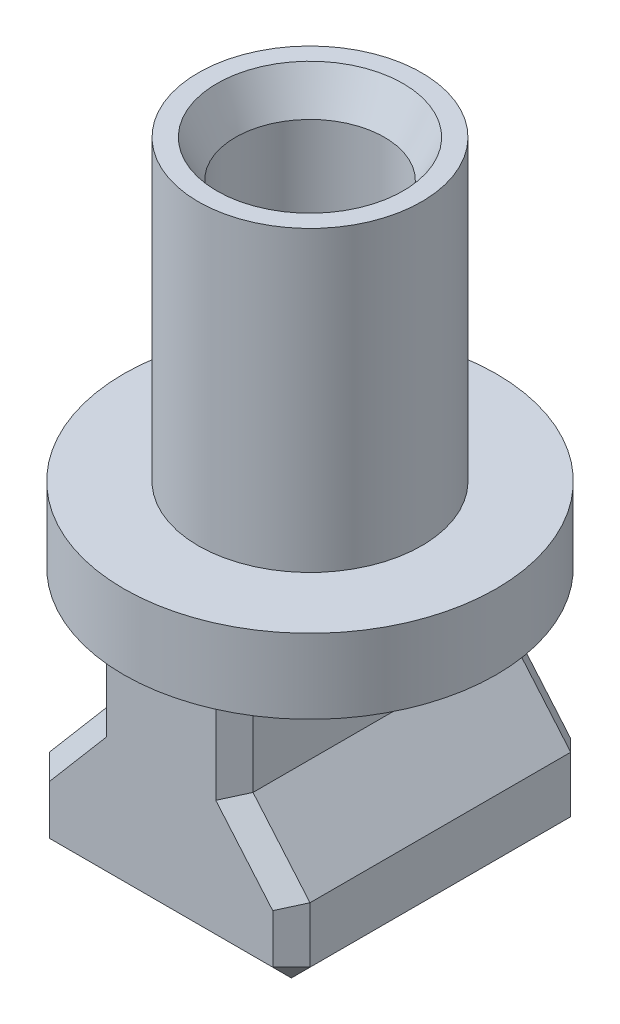
ISO-10303-21;
HEADER;
FILE_DESCRIPTION(('STEP AP214'),'2;1');
FILE_NAME('part.step','',(''),(''),'','','');
FILE_SCHEMA(('AUTOMOTIVE_DESIGN { 1 0 10303 214 1 1 1 1 }'));
ENDSEC;
DATA;
#1=APPLICATION_CONTEXT('core data for automotive mechanical design processes');
#2=APPLICATION_PROTOCOL_DEFINITION('international standard','automotive_design',2000,#1);
#3=PRODUCT_CONTEXT('',#1,'mechanical');
#4=PRODUCT('Part','Part','',(#3));
#5=PRODUCT_RELATED_PRODUCT_CATEGORY('part','',(#4));
#6=PRODUCT_DEFINITION_FORMATION('','',#4);
#7=PRODUCT_DEFINITION_CONTEXT('part definition',#1,'design');
#8=PRODUCT_DEFINITION('design','',#6,#7);
#9=PRODUCT_DEFINITION_SHAPE('','',#8);
#10=(LENGTH_UNIT() NAMED_UNIT(*) SI_UNIT(.MILLI.,.METRE.));
#11=(NAMED_UNIT(*) PLANE_ANGLE_UNIT() SI_UNIT($,.RADIAN.));
#12=(NAMED_UNIT(*) SI_UNIT($,.STERADIAN.) SOLID_ANGLE_UNIT());
#13=UNCERTAINTY_MEASURE_WITH_UNIT(LENGTH_MEASURE(1.E-05),#10,'distance_accuracy_value','');
#14=(GEOMETRIC_REPRESENTATION_CONTEXT(3) GLOBAL_UNCERTAINTY_ASSIGNED_CONTEXT((#13)) GLOBAL_UNIT_ASSIGNED_CONTEXT((#10,
#11,#12)) REPRESENTATION_CONTEXT('',''));
#15=CARTESIAN_POINT('',(0.,0.,0.));
#16=DIRECTION('',(0.,0.,1.));
#17=DIRECTION('',(1.,0.,0.));
#18=AXIS2_PLACEMENT_3D('',#15,#16,#17);
#19=CARTESIAN_POINT('',(-0.142171186372,-8.3,0.));
#20=DIRECTION('',(1.,0.,0.));
#21=DIRECTION('',(0.,0.,-1.));
#22=AXIS2_PLACEMENT_3D('',#19,#20,#21);
#23=PLANE('',#22);
#24=DIRECTION('',(0.,0.,-1.));
#25=VECTOR('',#24,1.);
#26=CARTESIAN_POINT('',(-0.142171186372,-2.,0.));
#27=LINE('',#26,#25);
#28=CARTESIAN_POINT('',(-0.142171186372,-2.,25.1199688894745));
#29=VERTEX_POINT('',#28);
#30=CARTESIAN_POINT('',(-0.142171186372,-2.,18.1199688894745));
#31=VERTEX_POINT('',#30);
#32=EDGE_CURVE('E274',#29,#31,#27,.T.);
#33=ORIENTED_EDGE('',*,*,#32,.T.);
#34=DIRECTION('',(0.,-1.,0.));
#35=VECTOR('',#34,1.);
#36=CARTESIAN_POINT('',(-0.142171186372,-8.3,18.1199688894745));
#37=LINE('',#36,#35);
#38=CARTESIAN_POINT('',(-0.142171186372,-4.5,18.1199688894745));
#39=VERTEX_POINT('',#38);
#40=EDGE_CURVE('E310',#31,#39,#37,.T.);
#41=ORIENTED_EDGE('',*,*,#40,.T.);
#42=DIRECTION('',(0.,0.,1.));
#43=VECTOR('',#42,1.);
#44=CARTESIAN_POINT('',(-0.142171186372,-4.5,13.5235192071276));
#45=LINE('',#44,#43);
#46=CARTESIAN_POINT('',(-0.142171186372,-4.5,25.1199688894745));
#47=VERTEX_POINT('',#46);
#48=EDGE_CURVE('E242',#39,#47,#45,.T.);
#49=ORIENTED_EDGE('',*,*,#48,.T.);
#50=DIRECTION('',(0.,1.,0.));
#51=VECTOR('',#50,1.);
#52=CARTESIAN_POINT('',(-0.142171186372,-2.,25.1199688894745));
#53=LINE('',#52,#51);
#54=EDGE_CURVE('E308',#47,#29,#53,.T.);
#55=ORIENTED_EDGE('',*,*,#54,.T.);
#56=EDGE_LOOP('',(#33,#41,#49,#55));
#57=FACE_BOUND('',#56,.T.);
#58=ADVANCED_FACE('F48',(#57),#23,.F.);
#59=CARTESIAN_POINT('',(0.,-2.,25.6199688894745));
#60=DIRECTION('',(0.,0.,1.));
#61=DIRECTION('',(1.,0.,0.));
#62=AXIS2_PLACEMENT_3D('',#59,#60,#61);
#63=PLANE('',#62);
#64=DIRECTION('',(-0.64764842009554,0.761939317759459,0.));
#65=VECTOR('',#64,1.);
#66=CARTESIAN_POINT('',(0.590193658175706,-1.49833539055065,25.6199688894745));
#67=LINE('',#66,#65);
#68=CARTESIAN_POINT('',(4.82782881362799,-6.48378851461216,25.6199688894745));
#69=VERTEX_POINT('',#68);
#70=CARTESIAN_POINT('',(3.29782881362799,-4.68378851461216,25.6199688894745));
#71=VERTEX_POINT('',#70);
#72=EDGE_CURVE('E66',#69,#71,#67,.T.);
#73=ORIENTED_EDGE('',*,*,#72,.T.);
#74=DIRECTION('',(0.,1.,0.));
#75=VECTOR('',#74,1.);
#76=CARTESIAN_POINT('',(3.29782881362799,-2.,25.6199688894745));
#77=LINE('',#76,#75);
#78=CARTESIAN_POINT('',(3.29782881362799,-2.,25.6199688894745));
#79=VERTEX_POINT('',#78);
#80=EDGE_CURVE('E345',#71,#79,#77,.T.);
#81=ORIENTED_EDGE('',*,*,#80,.T.);
#82=DIRECTION('',(1.,0.,0.));
#83=VECTOR('',#82,1.);
#84=CARTESIAN_POINT('',(0.,-2.,25.6199688894745));
#85=LINE('',#84,#83);
#86=CARTESIAN_POINT('',(0.357828813628009,-2.,25.6199688894745));
#87=VERTEX_POINT('',#86);
#88=EDGE_CURVE('E279',#87,#79,#85,.T.);
#89=ORIENTED_EDGE('',*,*,#88,.F.);
#90=DIRECTION('',(0.,-1.,0.));
#91=VECTOR('',#90,1.);
#92=CARTESIAN_POINT('',(0.357828813628009,-4.5,25.6199688894745));
#93=LINE('',#92,#91);
#94=CARTESIAN_POINT('',(0.357828813628009,-4.68378851461216,25.6199688894745));
#95=VERTEX_POINT('',#94);
#96=EDGE_CURVE('E335',#87,#95,#93,.T.);
#97=ORIENTED_EDGE('',*,*,#96,.T.);
#98=DIRECTION('',(-0.647648420095541,-0.761939317759459,0.));
#99=VECTOR('',#98,1.);
#100=CARTESIAN_POINT('',(-1.29120152749226,-6.62382421004778,25.6199688894745));
#101=LINE('',#100,#99);
#102=CARTESIAN_POINT('',(-1.17217118637199,-6.48378851461216,25.6199688894745));
#103=VERTEX_POINT('',#102);
#104=EDGE_CURVE('E337',#95,#103,#101,.T.);
#105=ORIENTED_EDGE('',*,*,#104,.T.);
#106=DIRECTION('',(0.,-1.,0.));
#107=VECTOR('',#106,1.);
#108=CARTESIAN_POINT('',(-1.17217118637199,-2.,25.6199688894745));
#109=LINE('',#108,#107);
#110=CARTESIAN_POINT('',(-1.17217118637199,-7.79999999999999,25.6199688894745));
#111=VERTEX_POINT('',#110);
#112=EDGE_CURVE('E339',#103,#111,#109,.T.);
#113=ORIENTED_EDGE('',*,*,#112,.T.);
#114=DIRECTION('',(1.,0.,0.));
#115=VECTOR('',#114,1.);
#116=CARTESIAN_POINT('',(0.,-7.79999999999999,25.6199688894745));
#117=LINE('',#116,#115);
#118=CARTESIAN_POINT('',(4.82782881362799,-7.79999999999999,25.6199688894745));
#119=VERTEX_POINT('',#118);
#120=EDGE_CURVE('E341',#111,#119,#117,.T.);
#121=ORIENTED_EDGE('',*,*,#120,.T.);
#122=DIRECTION('',(0.,1.,0.));
#123=VECTOR('',#122,1.);
#124=CARTESIAN_POINT('',(4.82782881362799,-6.3,25.6199688894745));
#125=LINE('',#124,#123);
#126=EDGE_CURVE('E71',#119,#69,#125,.T.);
#127=ORIENTED_EDGE('',*,*,#126,.T.);
#128=EDGE_LOOP('',(#73,#81,#89,#97,#105,#113,#121,#127));
#129=FACE_BOUND('',#128,.T.);
#130=ADVANCED_FACE('F438',(#129),#63,.T.);
#131=CARTESIAN_POINT('',(0.,-8.3,0.));
#132=DIRECTION('',(0.,-1.,0.));
#133=DIRECTION('',(0.,0.,-1.));
#134=AXIS2_PLACEMENT_3D('',#131,#132,#133);
#135=PLANE('',#134);
#136=DIRECTION('',(0.,0.,-1.));
#137=VECTOR('',#136,1.);
#138=CARTESIAN_POINT('',(-1.17217118637199,-8.3,0.));
#139=LINE('',#138,#137);
#140=CARTESIAN_POINT('',(-1.17217118637199,-8.3,25.1199688894745));
#141=VERTEX_POINT('',#140);
#142=CARTESIAN_POINT('',(-1.17217118637199,-8.3,18.1199688894745));
#143=VERTEX_POINT('',#142);
#144=EDGE_CURVE('E183',#141,#143,#139,.T.);
#145=ORIENTED_EDGE('',*,*,#144,.T.);
#146=DIRECTION('',(1.,0.,0.));
#147=VECTOR('',#146,1.);
#148=CARTESIAN_POINT('',(5.327828813628,-8.3,18.1199688894745));
#149=LINE('',#148,#147);
#150=CARTESIAN_POINT('',(4.827828813628,-8.3,18.1199688894745));
#151=VERTEX_POINT('',#150);
#152=EDGE_CURVE('E179',#143,#151,#149,.T.);
#153=ORIENTED_EDGE('',*,*,#152,.T.);
#154=DIRECTION('',(0.,0.,1.));
#155=VECTOR('',#154,1.);
#156=CARTESIAN_POINT('',(4.827828813628,-8.3,25.6199688894745));
#157=LINE('',#156,#155);
#158=CARTESIAN_POINT('',(4.827828813628,-8.3,25.1199688894745));
#159=VERTEX_POINT('',#158);
#160=EDGE_CURVE('E173',#151,#159,#157,.T.);
#161=ORIENTED_EDGE('',*,*,#160,.T.);
#162=DIRECTION('',(-1.,0.,0.));
#163=VECTOR('',#162,1.);
#164=CARTESIAN_POINT('',(0.,-8.3,25.1199688894745));
#165=LINE('',#164,#163);
#166=EDGE_CURVE('E176',#159,#141,#165,.T.);
#167=ORIENTED_EDGE('',*,*,#166,.T.);
#168=EDGE_LOOP('',(#145,#153,#161,#167));
#169=FACE_BOUND('',#168,.T.);
#170=ADVANCED_FACE('F175',(#169),#135,.T.);
#171=CARTESIAN_POINT('',(3.797828813628,-8.3,0.));
#172=DIRECTION('',(1.,0.,0.));
#173=DIRECTION('',(0.,0.,-1.));
#174=AXIS2_PLACEMENT_3D('',#171,#172,#173);
#175=PLANE('',#174);
#176=DIRECTION('',(0.,0.,1.));
#177=VECTOR('',#176,1.);
#178=CARTESIAN_POINT('',(3.797828813628,-4.5,13.5235192071276));
#179=LINE('',#178,#177);
#180=CARTESIAN_POINT('',(3.797828813628,-4.5,18.1199688894745));
#181=VERTEX_POINT('',#180);
#182=CARTESIAN_POINT('',(3.797828813628,-4.5,25.1199688894745));
#183=VERTEX_POINT('',#182);
#184=EDGE_CURVE('E262',#181,#183,#179,.T.);
#185=ORIENTED_EDGE('',*,*,#184,.F.);
#186=DIRECTION('',(0.,1.,0.));
#187=VECTOR('',#186,1.);
#188=CARTESIAN_POINT('',(3.797828813628,-2.,18.1199688894745));
#189=LINE('',#188,#187);
#190=CARTESIAN_POINT('',(3.797828813628,-2.,18.1199688894745));
#191=VERTEX_POINT('',#190);
#192=EDGE_CURVE('E324',#181,#191,#189,.T.);
#193=ORIENTED_EDGE('',*,*,#192,.T.);
#194=DIRECTION('',(0.,0.,-1.));
#195=VECTOR('',#194,1.);
#196=CARTESIAN_POINT('',(3.797828813628,-2.,0.));
#197=LINE('',#196,#195);
#198=CARTESIAN_POINT('',(3.797828813628,-2.,25.1199688894745));
#199=VERTEX_POINT('',#198);
#200=EDGE_CURVE('E270',#199,#191,#197,.T.);
#201=ORIENTED_EDGE('',*,*,#200,.F.);
#202=DIRECTION('',(0.,-1.,0.));
#203=VECTOR('',#202,1.);
#204=CARTESIAN_POINT('',(3.797828813628,-8.3,25.1199688894745));
#205=LINE('',#204,#203);
#206=EDGE_CURVE('E322',#199,#183,#205,.T.);
#207=ORIENTED_EDGE('',*,*,#206,.T.);
#208=EDGE_LOOP('',(#185,#193,#201,#207));
#209=FACE_BOUND('',#208,.T.);
#210=ADVANCED_FACE('F411',(#209),#175,.T.);
#211=CARTESIAN_POINT('',(0.,-8.3,17.6199688894745));
#212=DIRECTION('',(0.,0.,1.));
#213=DIRECTION('',(1.,0.,0.));
#214=AXIS2_PLACEMENT_3D('',#211,#212,#213);
#215=PLANE('',#214);
#216=DIRECTION('',(0.647648420095541,0.761939317759459,0.));
#217=VECTOR('',#216,1.);
#218=CARTESIAN_POINT('',(-1.57674946238122,-6.95976295697596,17.6199688894745));
#219=LINE('',#218,#217);
#220=CARTESIAN_POINT('',(-1.172171186372,-6.48378851461217,17.6199688894745));
#221=VERTEX_POINT('',#220);
#222=CARTESIAN_POINT('',(0.357828813628009,-4.68378851461216,17.6199688894745));
#223=VERTEX_POINT('',#222);
#224=EDGE_CURVE('E304',#221,#223,#219,.T.);
#225=ORIENTED_EDGE('',*,*,#224,.T.);
#226=DIRECTION('',(0.,1.,0.));
#227=VECTOR('',#226,1.);
#228=CARTESIAN_POINT('',(0.357828813628009,-8.3,17.6199688894745));
#229=LINE('',#228,#227);
#230=CARTESIAN_POINT('',(0.357828813628009,-2.,17.6199688894745));
#231=VERTEX_POINT('',#230);
#232=EDGE_CURVE('E306',#223,#231,#229,.T.);
#233=ORIENTED_EDGE('',*,*,#232,.T.);
#234=DIRECTION('',(1.,0.,0.));
#235=VECTOR('',#234,1.);
#236=CARTESIAN_POINT('',(0.,-2.,17.6199688894745));
#237=LINE('',#236,#235);
#238=CARTESIAN_POINT('',(3.29782881362799,-2.,17.6199688894745));
#239=VERTEX_POINT('',#238);
#240=EDGE_CURVE('E282',#231,#239,#237,.T.);
#241=ORIENTED_EDGE('',*,*,#240,.T.);
#242=DIRECTION('',(0.,-1.,0.));
#243=VECTOR('',#242,1.);
#244=CARTESIAN_POINT('',(3.29782881362799,-4.5,17.6199688894745));
#245=LINE('',#244,#243);
#246=CARTESIAN_POINT('',(3.29782881362799,-4.68378851461215,17.6199688894745));
#247=VERTEX_POINT('',#246);
#248=EDGE_CURVE('E297',#239,#247,#245,.T.);
#249=ORIENTED_EDGE('',*,*,#248,.T.);
#250=DIRECTION('',(0.64764842009554,-0.761939317759459,0.));
#251=VECTOR('',#250,1.);
#252=CARTESIAN_POINT('',(4.94685915474827,-6.62382421004777,17.6199688894745));
#253=LINE('',#252,#251);
#254=CARTESIAN_POINT('',(4.82782881362799,-6.48378851461215,17.6199688894745));
#255=VERTEX_POINT('',#254);
#256=EDGE_CURVE('E295',#247,#255,#253,.T.);
#257=ORIENTED_EDGE('',*,*,#256,.T.);
#258=DIRECTION('',(0.,-1.,0.));
#259=VECTOR('',#258,1.);
#260=CARTESIAN_POINT('',(4.82782881362799,-8.3,17.6199688894745));
#261=LINE('',#260,#259);
#262=CARTESIAN_POINT('',(4.82782881362799,-7.79999999999999,17.6199688894745));
#263=VERTEX_POINT('',#262);
#264=EDGE_CURVE('E293',#255,#263,#261,.T.);
#265=ORIENTED_EDGE('',*,*,#264,.T.);
#266=DIRECTION('',(-1.,0.,0.));
#267=VECTOR('',#266,1.);
#268=CARTESIAN_POINT('',(-1.672171186372,-7.79999999999999,17.6199688894745));
#269=LINE('',#268,#267);
#270=CARTESIAN_POINT('',(-1.172171186372,-7.79999999999999,17.6199688894745));
#271=VERTEX_POINT('',#270);
#272=EDGE_CURVE('E299',#263,#271,#269,.T.);
#273=ORIENTED_EDGE('',*,*,#272,.T.);
#274=DIRECTION('',(0.,1.,0.));
#275=VECTOR('',#274,1.);
#276=CARTESIAN_POINT('',(-1.172171186372,-6.3,17.6199688894745));
#277=LINE('',#276,#275);
#278=EDGE_CURVE('E302',#271,#221,#277,.T.);
#279=ORIENTED_EDGE('',*,*,#278,.T.);
#280=EDGE_LOOP('',(#225,#233,#241,#249,#257,#265,#273,#279));
#281=FACE_BOUND('',#280,.T.);
#282=ADVANCED_FACE('F378',(#281),#215,.F.);
#283=CARTESIAN_POINT('',(1.827828813628,-2.,21.6199688894745));
#284=DIRECTION('',(0.,1.,0.));
#285=DIRECTION('',(0.,0.,1.));
#286=AXIS2_PLACEMENT_3D('',#283,#284,#285);
#287=PLANE('',#286);
#288=CARTESIAN_POINT('',(1.827828813628,-2.,21.6199688894745));
#289=DIRECTION('',(0.,1.,0.));
#290=DIRECTION('',(0.,0.,1.));
#291=AXIS2_PLACEMENT_3D('',#288,#289,#290);
#292=CIRCLE('',#291,5.);
#293=CARTESIAN_POINT('',(1.827828813628,-2.,26.6199688894745));
#294=VERTEX_POINT('',#293);
#295=EDGE_CURVE('E265',#294,#294,#292,.T.);
#296=ORIENTED_EDGE('',*,*,#295,.F.);
#297=EDGE_LOOP('',(#296));
#298=FACE_BOUND('',#297,.T.);
#299=ORIENTED_EDGE('',*,*,#32,.F.);
#300=DIRECTION('',(0.707106781186551,0.,0.707106781186544));
#301=VECTOR('',#300,1.);
#302=CARTESIAN_POINT('',(-0.907171186371988,-2.,24.3549688894745));
#303=LINE('',#302,#301);
#304=EDGE_CURVE('E13',#29,#87,#303,.T.);
#305=ORIENTED_EDGE('',*,*,#304,.T.);
#306=ORIENTED_EDGE('',*,*,#88,.T.);
#307=DIRECTION('',(-0.707106781186551,0.,0.707106781186544));
#308=VECTOR('',#307,1.);
#309=CARTESIAN_POINT('',(4.56282881362799,-2.,24.3549688894745));
#310=LINE('',#309,#308);
#311=EDGE_CURVE('E58',#79,#199,#310,.F.);
#312=ORIENTED_EDGE('',*,*,#311,.T.);
#313=ORIENTED_EDGE('',*,*,#200,.T.);
#314=DIRECTION('',(-0.707106781186551,0.,-0.707106781186544));
#315=VECTOR('',#314,1.);
#316=CARTESIAN_POINT('',(4.56282881362799,-2.,18.8849688894745));
#317=LINE('',#316,#315);
#318=EDGE_CURVE('E349',#191,#239,#317,.T.);
#319=ORIENTED_EDGE('',*,*,#318,.T.);
#320=ORIENTED_EDGE('',*,*,#240,.F.);
#321=DIRECTION('',(0.707106781186551,0.,-0.707106781186544));
#322=VECTOR('',#321,1.);
#323=CARTESIAN_POINT('',(-0.907171186371988,-2.,18.8849688894745));
#324=LINE('',#323,#322);
#325=EDGE_CURVE('E347',#231,#31,#324,.F.);
#326=ORIENTED_EDGE('',*,*,#325,.T.);
#327=EDGE_LOOP('',(#299,#305,#306,#312,#313,#319,#320,#326));
#328=FACE_BOUND('',#327,.T.);
#329=ADVANCED_FACE('F415',(#298,#328),#287,.F.);
#330=CARTESIAN_POINT('',(1.827828813628,0.,21.6199688894745));
#331=DIRECTION('',(0.,-1.,0.));
#332=DIRECTION('',(0.,0.,-1.));
#333=AXIS2_PLACEMENT_3D('',#330,#331,#332);
#334=CYLINDRICAL_SURFACE('',#333,5.);
#335=CARTESIAN_POINT('',(1.827828813628,0.,21.6199688894745));
#336=DIRECTION('',(0.,1.,0.));
#337=DIRECTION('',(0.,0.,1.));
#338=AXIS2_PLACEMENT_3D('',#335,#336,#337);
#339=CIRCLE('',#338,5.);
#340=CARTESIAN_POINT('',(1.827828813628,0.,26.6199688894745));
#341=VERTEX_POINT('',#340);
#342=EDGE_CURVE('E271',#341,#341,#339,.T.);
#343=ORIENTED_EDGE('',*,*,#342,.F.);
#344=EDGE_LOOP('',(#343));
#345=FACE_BOUND('',#344,.T.);
#346=ORIENTED_EDGE('',*,*,#295,.T.);
#347=EDGE_LOOP('',(#346));
#348=FACE_BOUND('',#347,.T.);
#349=ADVANCED_FACE('F452',(#345,#348),#334,.T.);
#350=CARTESIAN_POINT('',(1.827828813628,0.,21.6199688894745));
#351=DIRECTION('',(0.,1.,0.));
#352=DIRECTION('',(0.,0.,1.));
#353=AXIS2_PLACEMENT_3D('',#350,#351,#352);
#354=PLANE('',#353);
#355=CARTESIAN_POINT('',(1.827828813628,0.,21.6199688894745));
#356=DIRECTION('',(0.,1.,0.));
#357=DIRECTION('',(0.,0.,1.));
#358=AXIS2_PLACEMENT_3D('',#355,#356,#357);
#359=CIRCLE('',#358,3.);
#360=CARTESIAN_POINT('',(1.827828813628,0.,24.6199688894745));
#361=VERTEX_POINT('',#360);
#362=EDGE_CURVE('E266',#361,#361,#359,.T.);
#363=ORIENTED_EDGE('',*,*,#362,.F.);
#364=EDGE_LOOP('',(#363));
#365=FACE_BOUND('',#364,.T.);
#366=ORIENTED_EDGE('',*,*,#342,.T.);
#367=EDGE_LOOP('',(#366));
#368=FACE_BOUND('',#367,.T.);
#369=ADVANCED_FACE('F459',(#365,#368),#354,.T.);
#370=CARTESIAN_POINT('',(1.827828813628,8.,21.6199688894745));
#371=DIRECTION('',(0.,-1.,0.));
#372=DIRECTION('',(0.,0.,-1.));
#373=AXIS2_PLACEMENT_3D('',#370,#371,#372);
#374=CYLINDRICAL_SURFACE('',#373,3.);
#375=CARTESIAN_POINT('',(1.827828813628,8.,21.6199688894745));
#376=DIRECTION('',(0.,1.,0.));
#377=DIRECTION('',(0.,0.,1.));
#378=AXIS2_PLACEMENT_3D('',#375,#376,#377);
#379=CIRCLE('',#378,3.);
#380=CARTESIAN_POINT('',(1.827828813628,8.,24.6199688894745));
#381=VERTEX_POINT('',#380);
#382=EDGE_CURVE('E261',#381,#381,#379,.T.);
#383=ORIENTED_EDGE('',*,*,#382,.F.);
#384=EDGE_LOOP('',(#383));
#385=FACE_BOUND('',#384,.T.);
#386=ORIENTED_EDGE('',*,*,#362,.T.);
#387=EDGE_LOOP('',(#386));
#388=FACE_BOUND('',#387,.T.);
#389=ADVANCED_FACE('F464',(#385,#388),#374,.T.);
#390=CARTESIAN_POINT('',(1.827828813628,8.,21.6199688894745));
#391=DIRECTION('',(0.,1.,0.));
#392=DIRECTION('',(0.,0.,1.));
#393=AXIS2_PLACEMENT_3D('',#390,#391,#392);
#394=PLANE('',#393);
#395=CARTESIAN_POINT('',(1.827828813628,8.,21.6199688894745));
#396=DIRECTION('',(0.,1.,0.));
#397=DIRECTION('',(0.,0.,1.));
#398=AXIS2_PLACEMENT_3D('',#395,#396,#397);
#399=CIRCLE('',#398,2.50000000000001);
#400=CARTESIAN_POINT('',(1.827828813628,8.,24.1199688894745));
#401=VERTEX_POINT('',#400);
#402=EDGE_CURVE('E195',#401,#401,#399,.F.);
#403=ORIENTED_EDGE('',*,*,#402,.T.);
#404=EDGE_LOOP('',(#403));
#405=FACE_BOUND('',#404,.T.);
#406=ORIENTED_EDGE('',*,*,#382,.T.);
#407=EDGE_LOOP('',(#406));
#408=FACE_BOUND('',#407,.T.);
#409=ADVANCED_FACE('F468',(#405,#408),#394,.T.);
#410=CARTESIAN_POINT('',(1.827828813628,-5.65685424949238,21.6199688894745));
#411=DIRECTION('',(0.,1.,0.));
#412=DIRECTION('',(0.,0.,1.));
#413=AXIS2_PLACEMENT_3D('',#410,#411,#412);
#414=CYLINDRICAL_SURFACE('',#413,2.);
#415=CARTESIAN_POINT('',(1.827828813628,6.99999999999999,21.6199688894745));
#416=DIRECTION('',(0.,1.,0.));
#417=DIRECTION('',(0.,0.,1.));
#418=AXIS2_PLACEMENT_3D('',#415,#416,#417);
#419=CIRCLE('',#418,2.);
#420=CARTESIAN_POINT('',(1.827828813628,6.99999999999999,23.6199688894745));
#421=VERTEX_POINT('',#420);
#422=EDGE_CURVE('E269',#421,#421,#419,.T.);
#423=ORIENTED_EDGE('',*,*,#422,.T.);
#424=EDGE_LOOP('',(#423));
#425=FACE_BOUND('',#424,.T.);
#426=CARTESIAN_POINT('',(1.827828813628,0.,21.6199688894745));
#427=DIRECTION('',(0.,1.,0.));
#428=DIRECTION('',(0.,0.,1.));
#429=AXIS2_PLACEMENT_3D('',#426,#427,#428);
#430=CIRCLE('',#429,2.);
#431=CARTESIAN_POINT('',(1.827828813628,0.,23.6199688894745));
#432=VERTEX_POINT('',#431);
#433=EDGE_CURVE('E258',#432,#432,#430,.F.);
#434=ORIENTED_EDGE('',*,*,#433,.T.);
#435=EDGE_LOOP('',(#434));
#436=FACE_BOUND('',#435,.T.);
#437=ADVANCED_FACE('F472',(#425,#436),#414,.F.);
#438=CARTESIAN_POINT('',(1.827828813628,0.,21.6199688894745));
#439=DIRECTION('',(0.,1.,0.));
#440=DIRECTION('',(0.,0.,1.));
#441=AXIS2_PLACEMENT_3D('',#438,#439,#440);
#442=PLANE('',#441);
#443=ORIENTED_EDGE('',*,*,#433,.F.);
#444=EDGE_LOOP('',(#443));
#445=FACE_BOUND('',#444,.T.);
#446=ADVANCED_FACE('F476',(#445),#442,.T.);
#447=CARTESIAN_POINT('',(1.827828813628,6.99999999999999,21.6199688894745));
#448=DIRECTION('',(0.,1.,0.));
#449=DIRECTION('',(0.,0.,1.));
#450=AXIS2_PLACEMENT_3D('',#447,#448,#449);
#451=CONICAL_SURFACE('',#450,2.,0.463647609000806);
#452=ORIENTED_EDGE('',*,*,#402,.F.);
#453=EDGE_LOOP('',(#452));
#454=FACE_BOUND('',#453,.T.);
#455=ORIENTED_EDGE('',*,*,#422,.F.);
#456=EDGE_LOOP('',(#455));
#457=FACE_BOUND('',#456,.T.);
#458=ADVANCED_FACE('F480',(#454,#457),#451,.F.);
#459=CARTESIAN_POINT('',(-1.672171186372,0.,13.5235192071276));
#460=DIRECTION('',(-1.,0.,0.));
#461=DIRECTION('',(0.,-1.,0.));
#462=AXIS2_PLACEMENT_3D('',#459,#460,#461);
#463=PLANE('',#462);
#464=DIRECTION('',(0.,0.,1.));
#465=VECTOR('',#464,1.);
#466=CARTESIAN_POINT('',(-1.672171186372,-6.3,13.5235192071276));
#467=LINE('',#466,#465);
#468=CARTESIAN_POINT('',(-1.672171186372,-6.3,18.1199688894745));
#469=VERTEX_POINT('',#468);
#470=CARTESIAN_POINT('',(-1.672171186372,-6.3,25.1199688894745));
#471=VERTEX_POINT('',#470);
#472=EDGE_CURVE('E248',#469,#471,#467,.T.);
#473=ORIENTED_EDGE('',*,*,#472,.F.);
#474=DIRECTION('',(0.,-1.,0.));
#475=VECTOR('',#474,1.);
#476=CARTESIAN_POINT('',(-1.672171186372,-8.3,18.1199688894745));
#477=LINE('',#476,#475);
#478=CARTESIAN_POINT('',(-1.672171186372,-7.8,18.1199688894745));
#479=VERTEX_POINT('',#478);
#480=EDGE_CURVE('E320',#469,#479,#477,.T.);
#481=ORIENTED_EDGE('',*,*,#480,.T.);
#482=DIRECTION('',(0.,0.,1.));
#483=VECTOR('',#482,1.);
#484=CARTESIAN_POINT('',(-1.672171186372,-7.8,13.5235192071276));
#485=LINE('',#484,#483);
#486=CARTESIAN_POINT('',(-1.672171186372,-7.8,25.1199688894745));
#487=VERTEX_POINT('',#486);
#488=EDGE_CURVE('E318',#479,#487,#485,.T.);
#489=ORIENTED_EDGE('',*,*,#488,.T.);
#490=DIRECTION('',(0.,1.,0.));
#491=VECTOR('',#490,1.);
#492=CARTESIAN_POINT('',(-1.672171186372,0.,25.1199688894745));
#493=LINE('',#492,#491);
#494=EDGE_CURVE('E316',#487,#471,#493,.T.);
#495=ORIENTED_EDGE('',*,*,#494,.T.);
#496=EDGE_LOOP('',(#473,#481,#489,#495));
#497=FACE_BOUND('',#496,.T.);
#498=ADVANCED_FACE('F482',(#497),#463,.T.);
#499=CARTESIAN_POINT('',(2.13807188019042,-1.81736109816186,13.5235192071276));
#500=DIRECTION('',(0.761939317759459,-0.647648420095541,0.));
#501=DIRECTION('',(0.647648420095541,0.761939317759459,0.));
#502=AXIS2_PLACEMENT_3D('',#499,#500,#501);
#503=PLANE('',#502);
#504=ORIENTED_EDGE('',*,*,#48,.F.);
#505=DIRECTION('',(-0.647648420095541,-0.761939317759459,0.));
#506=VECTOR('',#505,1.);
#507=CARTESIAN_POINT('',(2.13807188019042,-1.81736109816186,18.1199688894745));
#508=LINE('',#507,#506);
#509=EDGE_CURVE('E314',#39,#469,#508,.T.);
#510=ORIENTED_EDGE('',*,*,#509,.T.);
#511=ORIENTED_EDGE('',*,*,#472,.T.);
#512=DIRECTION('',(0.647648420095541,0.761939317759459,0.));
#513=VECTOR('',#512,1.);
#514=CARTESIAN_POINT('',(-0.142171186372,-4.5,25.1199688894745));
#515=LINE('',#514,#513);
#516=EDGE_CURVE('E312',#471,#47,#515,.T.);
#517=ORIENTED_EDGE('',*,*,#516,.T.);
#518=EDGE_LOOP('',(#504,#510,#511,#517));
#519=FACE_BOUND('',#518,.T.);
#520=ADVANCED_FACE('F485',(#519),#503,.F.);
#521=CARTESIAN_POINT('',(-0.0157742736557328,-0.0134081326073729,13.5235192071276));
#522=DIRECTION('',(0.761939317759459,0.64764842009554,0.));
#523=DIRECTION('',(-0.64764842009554,0.761939317759459,0.));
#524=AXIS2_PLACEMENT_3D('',#521,#522,#523);
#525=PLANE('',#524);
#526=DIRECTION('',(0.,0.,1.));
#527=VECTOR('',#526,1.);
#528=CARTESIAN_POINT('',(5.327828813628,-6.3,13.5235192071276));
#529=LINE('',#528,#527);
#530=CARTESIAN_POINT('',(5.327828813628,-6.3,18.1199688894745));
#531=VERTEX_POINT('',#530);
#532=CARTESIAN_POINT('',(5.327828813628,-6.3,25.1199688894745));
#533=VERTEX_POINT('',#532);
#534=EDGE_CURVE('E254',#531,#533,#529,.T.);
#535=ORIENTED_EDGE('',*,*,#534,.F.);
#536=DIRECTION('',(-0.64764842009554,0.761939317759459,0.));
#537=VECTOR('',#536,1.);
#538=CARTESIAN_POINT('',(3.797828813628,-4.5,18.1199688894745));
#539=LINE('',#538,#537);
#540=EDGE_CURVE('E328',#531,#181,#539,.T.);
#541=ORIENTED_EDGE('',*,*,#540,.T.);
#542=ORIENTED_EDGE('',*,*,#184,.T.);
#543=DIRECTION('',(0.64764842009554,-0.761939317759459,0.));
#544=VECTOR('',#543,1.);
#545=CARTESIAN_POINT('',(-0.0157742736557328,-0.0134081326073729,25.1199688894745));
#546=LINE('',#545,#544);
#547=EDGE_CURVE('E326',#183,#533,#546,.T.);
#548=ORIENTED_EDGE('',*,*,#547,.T.);
#549=EDGE_LOOP('',(#535,#541,#542,#548));
#550=FACE_BOUND('',#549,.T.);
#551=ADVANCED_FACE('F397',(#550),#525,.T.);
#552=CARTESIAN_POINT('',(5.327828813628,0.,13.5235192071276));
#553=DIRECTION('',(-1.,0.,0.));
#554=DIRECTION('',(0.,0.,1.));
#555=AXIS2_PLACEMENT_3D('',#552,#553,#554);
#556=PLANE('',#555);
#557=DIRECTION('',(0.,0.,-1.));
#558=VECTOR('',#557,1.);
#559=CARTESIAN_POINT('',(5.327828813628,-7.79999999999999,17.6199688894745));
#560=LINE('',#559,#558);
#561=CARTESIAN_POINT('',(5.327828813628,-7.79999999999999,25.1199688894745));
#562=VERTEX_POINT('',#561);
#563=CARTESIAN_POINT('',(5.327828813628,-7.79999999999999,18.1199688894745));
#564=VERTEX_POINT('',#563);
#565=EDGE_CURVE('E206',#562,#564,#560,.T.);
#566=ORIENTED_EDGE('',*,*,#565,.T.);
#567=DIRECTION('',(0.,1.,0.));
#568=VECTOR('',#567,1.);
#569=CARTESIAN_POINT('',(5.327828813628,0.,18.1199688894745));
#570=LINE('',#569,#568);
#571=EDGE_CURVE('E333',#564,#531,#570,.T.);
#572=ORIENTED_EDGE('',*,*,#571,.T.);
#573=ORIENTED_EDGE('',*,*,#534,.T.);
#574=DIRECTION('',(0.,-1.,0.));
#575=VECTOR('',#574,1.);
#576=CARTESIAN_POINT('',(5.327828813628,-8.3,25.1199688894745));
#577=LINE('',#576,#575);
#578=EDGE_CURVE('E330',#533,#562,#577,.T.);
#579=ORIENTED_EDGE('',*,*,#578,.T.);
#580=EDGE_LOOP('',(#566,#572,#573,#579));
#581=FACE_BOUND('',#580,.T.);
#582=ADVANCED_FACE('F393',(#581),#556,.F.);
#583=CARTESIAN_POINT('',(-0.142171186372,-8.3,25.1199688894745));
#584=DIRECTION('',(-0.707106781186544,0.,0.707106781186551));
#585=DIRECTION('',(0.,-1.,0.));
#586=AXIS2_PLACEMENT_3D('',#583,#584,#585);
#587=PLANE('',#586);
#588=ORIENTED_EDGE('',*,*,#304,.F.);
#589=ORIENTED_EDGE('',*,*,#54,.F.);
#590=DIRECTION('',(0.684367820612152,-0.251557890397335,0.684367820612145));
#591=VECTOR('',#590,1.);
#592=CARTESIAN_POINT('',(0.463963807831072,-4.72280130047807,25.7261038836775));
#593=LINE('',#592,#591);
#594=EDGE_CURVE('E53',#95,#47,#593,.F.);
#595=ORIENTED_EDGE('',*,*,#594,.F.);
#596=ORIENTED_EDGE('',*,*,#96,.F.);
#597=EDGE_LOOP('',(#588,#589,#595,#596));
#598=FACE_BOUND('',#597,.T.);
#599=ADVANCED_FACE('F51',(#598),#587,.T.);
#600=CARTESIAN_POINT('',(3.29782881362799,-2.,25.6199688894745));
#601=DIRECTION('',(-0.707106781186544,0.,-0.707106781186551));
#602=DIRECTION('',(0.,1.,0.));
#603=AXIS2_PLACEMENT_3D('',#600,#601,#602);
#604=PLANE('',#603);
#605=ORIENTED_EDGE('',*,*,#311,.F.);
#606=ORIENTED_EDGE('',*,*,#80,.F.);
#607=DIRECTION('',(-0.684367820612152,-0.251557890397334,0.684367820612145));
#608=VECTOR('',#607,1.);
#609=CARTESIAN_POINT('',(3.75986481276111,-4.51395469465612,25.1579328903414));
#610=LINE('',#609,#608);
#611=EDGE_CURVE('E236',#183,#71,#610,.T.);
#612=ORIENTED_EDGE('',*,*,#611,.F.);
#613=ORIENTED_EDGE('',*,*,#206,.F.);
#614=EDGE_LOOP('',(#605,#606,#612,#613));
#615=FACE_BOUND('',#614,.T.);
#616=ADVANCED_FACE('F420',(#615),#604,.F.);
#617=CARTESIAN_POINT('',(2.13807188019042,-1.81736109816186,25.1199688894745));
#618=DIRECTION('',(-0.538772458440362,0.457956589674308,0.707106781186551));
#619=DIRECTION('',(-0.647648420095541,-0.761939317759459,0.));
#620=AXIS2_PLACEMENT_3D('',#617,#618,#619);
#621=PLANE('',#620);
#622=ORIENTED_EDGE('',*,*,#594,.T.);
#623=ORIENTED_EDGE('',*,*,#516,.F.);
#624=DIRECTION('',(-0.684367820612151,0.251557890397336,-0.684367820612145));
#625=VECTOR('',#624,1.);
#626=CARTESIAN_POINT('',(-0.659331067294336,-6.67229676204977,26.1328090085521));
#627=LINE('',#626,#625);
#628=EDGE_CURVE('E234',#103,#471,#627,.T.);
#629=ORIENTED_EDGE('',*,*,#628,.F.);
#630=ORIENTED_EDGE('',*,*,#104,.F.);
#631=EDGE_LOOP('',(#622,#623,#629,#630));
#632=FACE_BOUND('',#631,.T.);
#633=ADVANCED_FACE('F516',(#632),#621,.T.);
#634=CARTESIAN_POINT('',(0.590193658175706,-1.49833539055065,25.6199688894745));
#635=DIRECTION('',(-0.538772458440363,-0.457956589674308,-0.707106781186551));
#636=DIRECTION('',(-0.64764842009554,0.761939317759459,0.));
#637=AXIS2_PLACEMENT_3D('',#634,#635,#636);
#638=PLANE('',#637);
#639=ORIENTED_EDGE('',*,*,#611,.T.);
#640=ORIENTED_EDGE('',*,*,#72,.F.);
#641=DIRECTION('',(0.684367820612152,0.251557890397334,-0.684367820612145));
#642=VECTOR('',#641,1.);
#643=CARTESIAN_POINT('',(6.41242500244479,-5.90132735500671,24.0353727006577));
#644=LINE('',#643,#642);
#645=EDGE_CURVE('E231',#533,#69,#644,.F.);
#646=ORIENTED_EDGE('',*,*,#645,.F.);
#647=ORIENTED_EDGE('',*,*,#547,.F.);
#648=EDGE_LOOP('',(#639,#640,#646,#647));
#649=FACE_BOUND('',#648,.T.);
#650=ADVANCED_FACE('F422',(#649),#638,.F.);
#651=CARTESIAN_POINT('',(0.357828813628009,-8.3,17.6199688894745));
#652=DIRECTION('',(0.707106781186544,0.,0.707106781186551));
#653=DIRECTION('',(0.,1.,0.));
#654=AXIS2_PLACEMENT_3D('',#651,#652,#653);
#655=PLANE('',#654);
#656=ORIENTED_EDGE('',*,*,#325,.F.);
#657=ORIENTED_EDGE('',*,*,#232,.F.);
#658=DIRECTION('',(0.684367820612152,-0.251557890397335,-0.684367820612145));
#659=VECTOR('',#658,1.);
#660=CARTESIAN_POINT('',(0.980389003311686,-4.91262733964942,16.9974086997908));
#661=LINE('',#660,#659);
#662=EDGE_CURVE('E228',#39,#223,#661,.T.);
#663=ORIENTED_EDGE('',*,*,#662,.F.);
#664=ORIENTED_EDGE('',*,*,#40,.F.);
#665=EDGE_LOOP('',(#656,#657,#663,#664));
#666=FACE_BOUND('',#665,.T.);
#667=ADVANCED_FACE('F530',(#666),#655,.F.);
#668=CARTESIAN_POINT('',(-1.17217118637199,-2.,25.6199688894745));
#669=DIRECTION('',(0.707106781186544,0.,-0.707106781186551));
#670=DIRECTION('',(0.,-1.,0.));
#671=AXIS2_PLACEMENT_3D('',#668,#669,#670);
#672=PLANE('',#671);
#673=ORIENTED_EDGE('',*,*,#628,.T.);
#674=ORIENTED_EDGE('',*,*,#494,.F.);
#675=DIRECTION('',(0.707106781186551,0.,0.707106781186544));
#676=VECTOR('',#675,1.);
#677=CARTESIAN_POINT('',(-1.672171186372,-7.8,25.1199688894745));
#678=LINE('',#677,#676);
#679=EDGE_CURVE('E225',#111,#487,#678,.F.);
#680=ORIENTED_EDGE('',*,*,#679,.F.);
#681=ORIENTED_EDGE('',*,*,#112,.F.);
#682=EDGE_LOOP('',(#673,#674,#680,#681));
#683=FACE_BOUND('',#682,.T.);
#684=ADVANCED_FACE('F434',(#683),#672,.F.);
#685=CARTESIAN_POINT('',(0.,-8.3,25.1199688894745));
#686=DIRECTION('',(0.,0.707106781186544,-0.707106781186551));
#687=DIRECTION('',(-1.,0.,0.));
#688=AXIS2_PLACEMENT_3D('',#685,#686,#687);
#689=PLANE('',#688);
#690=DIRECTION('',(0.,0.707106781186551,0.707106781186544));
#691=VECTOR('',#690,1.);
#692=CARTESIAN_POINT('',(4.827828813628,-8.3,25.1199688894745));
#693=LINE('',#692,#691);
#694=EDGE_CURVE('E190',#119,#159,#693,.F.);
#695=ORIENTED_EDGE('',*,*,#694,.F.);
#696=ORIENTED_EDGE('',*,*,#120,.F.);
#697=DIRECTION('',(0.,-0.707106781186551,-0.707106781186544));
#698=VECTOR('',#697,1.);
#699=CARTESIAN_POINT('',(-1.17217118637199,-8.05,25.3699688894745));
#700=LINE('',#699,#698);
#701=EDGE_CURVE('E193',#141,#111,#700,.F.);
#702=ORIENTED_EDGE('',*,*,#701,.F.);
#703=ORIENTED_EDGE('',*,*,#166,.F.);
#704=EDGE_LOOP('',(#695,#696,#702,#703));
#705=FACE_BOUND('',#704,.T.);
#706=ADVANCED_FACE('F188',(#705),#689,.F.);
#707=CARTESIAN_POINT('',(5.327828813628,0.,25.1199688894745));
#708=DIRECTION('',(0.707106781186544,0.,0.707106781186551));
#709=DIRECTION('',(0.,1.,0.));
#710=AXIS2_PLACEMENT_3D('',#707,#708,#709);
#711=PLANE('',#710);
#712=ORIENTED_EDGE('',*,*,#645,.T.);
#713=ORIENTED_EDGE('',*,*,#126,.F.);
#714=DIRECTION('',(-0.707106781186551,0.,0.707106781186544));
#715=VECTOR('',#714,1.);
#716=CARTESIAN_POINT('',(5.077828813628,-7.79999999999999,25.3699688894745));
#717=LINE('',#716,#715);
#718=EDGE_CURVE('E203',#562,#119,#717,.T.);
#719=ORIENTED_EDGE('',*,*,#718,.F.);
#720=ORIENTED_EDGE('',*,*,#578,.F.);
#721=EDGE_LOOP('',(#712,#713,#719,#720));
#722=FACE_BOUND('',#721,.T.);
#723=ADVANCED_FACE('F425',(#722),#711,.T.);
#724=CARTESIAN_POINT('',(3.797828813628,-8.3,18.1199688894745));
#725=DIRECTION('',(0.707106781186544,0.,-0.707106781186551));
#726=DIRECTION('',(0.,-1.,0.));
#727=AXIS2_PLACEMENT_3D('',#724,#725,#726);
#728=PLANE('',#727);
#729=ORIENTED_EDGE('',*,*,#318,.F.);
#730=ORIENTED_EDGE('',*,*,#192,.F.);
#731=DIRECTION('',(0.684367820612155,0.251557890397315,0.684367820612148));
#732=VECTOR('',#731,1.);
#733=CARTESIAN_POINT('',(3.14362793783379,-4.74046921444037,17.4657680136803));
#734=LINE('',#733,#732);
#735=EDGE_CURVE('E220',#247,#181,#734,.T.);
#736=ORIENTED_EDGE('',*,*,#735,.F.);
#737=ORIENTED_EDGE('',*,*,#248,.F.);
#738=EDGE_LOOP('',(#729,#730,#736,#737));
#739=FACE_BOUND('',#738,.T.);
#740=ADVANCED_FACE('F408',(#739),#728,.T.);
#741=CARTESIAN_POINT('',(2.13807188019042,-1.81736109816186,18.1199688894745));
#742=DIRECTION('',(0.538772458440362,-0.457956589674308,0.707106781186551));
#743=DIRECTION('',(-0.647648420095541,-0.761939317759459,0.));
#744=AXIS2_PLACEMENT_3D('',#741,#742,#743);
#745=PLANE('',#744);
#746=ORIENTED_EDGE('',*,*,#662,.T.);
#747=ORIENTED_EDGE('',*,*,#224,.F.);
#748=DIRECTION('',(-0.684367820612142,0.251557890397351,0.684367820612148));
#749=VECTOR('',#748,1.);
#750=CARTESIAN_POINT('',(-0.859495622064532,-6.59872086965135,17.307293325167));
#751=LINE('',#750,#749);
#752=EDGE_CURVE('E211',#469,#221,#751,.F.);
#753=ORIENTED_EDGE('',*,*,#752,.F.);
#754=ORIENTED_EDGE('',*,*,#509,.F.);
#755=EDGE_LOOP('',(#746,#747,#753,#754));
#756=FACE_BOUND('',#755,.T.);
#757=ADVANCED_FACE('F432',(#756),#745,.F.);
#758=CARTESIAN_POINT('',(-1.672171186372,-7.8,25.1199688894745));
#759=DIRECTION('',(-0.57735026918962,-0.577350269189626,0.577350269189631));
#760=DIRECTION('',(0.,-0.707106781186551,-0.707106781186544));
#761=AXIS2_PLACEMENT_3D('',#758,#759,#760);
#762=PLANE('',#761);
#763=ORIENTED_EDGE('',*,*,#701,.T.);
#764=ORIENTED_EDGE('',*,*,#679,.T.);
#765=DIRECTION('',(-0.707106781186551,0.707106781186544,0.));
#766=VECTOR('',#765,1.);
#767=CARTESIAN_POINT('',(-1.672171186372,-7.8,25.1199688894745));
#768=LINE('',#767,#766);
#769=EDGE_CURVE('E207',#141,#487,#768,.T.);
#770=ORIENTED_EDGE('',*,*,#769,.F.);
#771=EDGE_LOOP('',(#763,#764,#770));
#772=FACE_BOUND('',#771,.T.);
#773=ADVANCED_FACE('F572',(#772),#762,.T.);
#774=CARTESIAN_POINT('',(4.827828813628,-8.3,25.1199688894745));
#775=DIRECTION('',(0.577350269189626,-0.57735026918962,0.577350269189632));
#776=DIRECTION('',(0.707106781186551,0.,-0.707106781186544));
#777=AXIS2_PLACEMENT_3D('',#774,#775,#776);
#778=PLANE('',#777);
#779=ORIENTED_EDGE('',*,*,#718,.T.);
#780=ORIENTED_EDGE('',*,*,#694,.T.);
#781=DIRECTION('',(0.707106781186544,0.707106781186551,0.));
#782=VECTOR('',#781,1.);
#783=CARTESIAN_POINT('',(4.827828813628,-8.3,25.1199688894745));
#784=LINE('',#783,#782);
#785=EDGE_CURVE('E200',#562,#159,#784,.F.);
#786=ORIENTED_EDGE('',*,*,#785,.F.);
#787=EDGE_LOOP('',(#779,#780,#786));
#788=FACE_BOUND('',#787,.T.);
#789=ADVANCED_FACE('F199',(#788),#778,.T.);
#790=CARTESIAN_POINT('',(3.69904706891591,-5.15580999142147,17.6199688894745));
#791=DIRECTION('',(0.538772458440368,0.457956589674313,-0.707106781186544));
#792=DIRECTION('',(-0.64764842009554,0.761939317759459,0.));
#793=AXIS2_PLACEMENT_3D('',#790,#791,#792);
#794=PLANE('',#793);
#795=ORIENTED_EDGE('',*,*,#735,.T.);
#796=ORIENTED_EDGE('',*,*,#540,.F.);
#797=DIRECTION('',(-0.684367820612155,-0.251557890397315,-0.684367820612148));
#798=VECTOR('',#797,1.);
#799=CARTESIAN_POINT('',(6.41242500244471,-5.90132735500678,19.2045650782912));
#800=LINE('',#799,#798);
#801=EDGE_CURVE('E208',#255,#531,#800,.F.);
#802=ORIENTED_EDGE('',*,*,#801,.F.);
#803=ORIENTED_EDGE('',*,*,#256,.F.);
#804=EDGE_LOOP('',(#795,#796,#802,#803));
#805=FACE_BOUND('',#804,.T.);
#806=ADVANCED_FACE('F401',(#805),#794,.T.);
#807=CARTESIAN_POINT('',(-1.172171186372,-8.3,17.6199688894745));
#808=DIRECTION('',(-0.70710678118655,0.,-0.707106781186545));
#809=DIRECTION('',(0.,-1.,0.));
#810=AXIS2_PLACEMENT_3D('',#807,#808,#809);
#811=PLANE('',#810);
#812=ORIENTED_EDGE('',*,*,#752,.T.);
#813=ORIENTED_EDGE('',*,*,#278,.F.);
#814=DIRECTION('',(0.707106781186545,0.,-0.70710678118655));
#815=VECTOR('',#814,1.);
#816=CARTESIAN_POINT('',(-1.172171186372,-7.79999999999999,17.6199688894745));
#817=LINE('',#816,#815);
#818=EDGE_CURVE('E214',#479,#271,#817,.T.);
#819=ORIENTED_EDGE('',*,*,#818,.F.);
#820=ORIENTED_EDGE('',*,*,#480,.F.);
#821=EDGE_LOOP('',(#812,#813,#819,#820));
#822=FACE_BOUND('',#821,.T.);
#823=ADVANCED_FACE('F373',(#822),#811,.T.);
#824=CARTESIAN_POINT('',(-1.672171186372,-7.8,13.5235192071276));
#825=DIRECTION('',(0.707106781186544,0.707106781186551,0.));
#826=DIRECTION('',(0.,0.,1.));
#827=AXIS2_PLACEMENT_3D('',#824,#825,#826);
#828=PLANE('',#827);
#829=ORIENTED_EDGE('',*,*,#769,.T.);
#830=ORIENTED_EDGE('',*,*,#488,.F.);
#831=DIRECTION('',(0.707106781186551,-0.707106781186544,0.));
#832=VECTOR('',#831,1.);
#833=CARTESIAN_POINT('',(-1.422171186372,-8.05,18.1199688894745));
#834=LINE('',#833,#832);
#835=EDGE_CURVE('E362',#143,#479,#834,.F.);
#836=ORIENTED_EDGE('',*,*,#835,.F.);
#837=ORIENTED_EDGE('',*,*,#144,.F.);
#838=EDGE_LOOP('',(#829,#830,#836,#837));
#839=FACE_BOUND('',#838,.T.);
#840=ADVANCED_FACE('F607',(#839),#828,.F.);
#841=CARTESIAN_POINT('',(4.827828813628,-8.3,0.));
#842=DIRECTION('',(0.707106781186551,-0.707106781186544,0.));
#843=DIRECTION('',(0.,0.,-1.));
#844=AXIS2_PLACEMENT_3D('',#841,#842,#843);
#845=PLANE('',#844);
#846=ORIENTED_EDGE('',*,*,#785,.T.);
#847=ORIENTED_EDGE('',*,*,#160,.F.);
#848=DIRECTION('',(-0.707106781186544,-0.707106781186551,0.));
#849=VECTOR('',#848,1.);
#850=CARTESIAN_POINT('',(4.827828813628,-8.3,18.1199688894745));
#851=LINE('',#850,#849);
#852=EDGE_CURVE('E359',#564,#151,#851,.T.);
#853=ORIENTED_EDGE('',*,*,#852,.F.);
#854=ORIENTED_EDGE('',*,*,#565,.F.);
#855=EDGE_LOOP('',(#846,#847,#853,#854));
#856=FACE_BOUND('',#855,.T.);
#857=ADVANCED_FACE('F205',(#856),#845,.T.);
#858=CARTESIAN_POINT('',(5.327828813628,0.,18.1199688894745));
#859=DIRECTION('',(-0.707106781186544,0.,0.707106781186551));
#860=DIRECTION('',(0.,1.,0.));
#861=AXIS2_PLACEMENT_3D('',#858,#859,#860);
#862=PLANE('',#861);
#863=ORIENTED_EDGE('',*,*,#801,.T.);
#864=ORIENTED_EDGE('',*,*,#571,.F.);
#865=DIRECTION('',(-0.707106781186551,0.,-0.707106781186544));
#866=VECTOR('',#865,1.);
#867=CARTESIAN_POINT('',(5.077828813628,-7.79999999999999,17.8699688894745));
#868=LINE('',#867,#866);
#869=EDGE_CURVE('E356',#263,#564,#868,.F.);
#870=ORIENTED_EDGE('',*,*,#869,.F.);
#871=ORIENTED_EDGE('',*,*,#264,.F.);
#872=EDGE_LOOP('',(#863,#864,#870,#871));
#873=FACE_BOUND('',#872,.T.);
#874=ADVANCED_FACE('F388',(#873),#862,.F.);
#875=CARTESIAN_POINT('',(-1.172171186372,-7.79999999999999,17.6199688894745));
#876=DIRECTION('',(-0.577350269189625,-0.577350269189626,-0.577350269189626));
#877=DIRECTION('',(0.,0.707106781186547,-0.707106781186548));
#878=AXIS2_PLACEMENT_3D('',#875,#876,#877);
#879=PLANE('',#878);
#880=ORIENTED_EDGE('',*,*,#835,.T.);
#881=ORIENTED_EDGE('',*,*,#818,.T.);
#882=DIRECTION('',(0.,-0.707106781186551,0.707106781186544));
#883=VECTOR('',#882,1.);
#884=CARTESIAN_POINT('',(-1.172171186372,-7.79999999999999,17.6199688894745));
#885=LINE('',#884,#883);
#886=EDGE_CURVE('E354',#143,#271,#885,.F.);
#887=ORIENTED_EDGE('',*,*,#886,.F.);
#888=EDGE_LOOP('',(#880,#881,#887));
#889=FACE_BOUND('',#888,.T.);
#890=ADVANCED_FACE('F369',(#889),#879,.T.);
#891=CARTESIAN_POINT('',(4.827828813628,-8.3,18.1199688894745));
#892=DIRECTION('',(0.577350269189626,-0.57735026918962,-0.577350269189632));
#893=DIRECTION('',(-0.707106781186551,0.,-0.707106781186544));
#894=AXIS2_PLACEMENT_3D('',#891,#892,#893);
#895=PLANE('',#894);
#896=ORIENTED_EDGE('',*,*,#869,.T.);
#897=ORIENTED_EDGE('',*,*,#852,.T.);
#898=DIRECTION('',(0.,0.707106781186551,-0.707106781186544));
#899=VECTOR('',#898,1.);
#900=CARTESIAN_POINT('',(4.827828813628,-8.3,18.1199688894745));
#901=LINE('',#900,#899);
#902=EDGE_CURVE('E352',#263,#151,#901,.F.);
#903=ORIENTED_EDGE('',*,*,#902,.F.);
#904=EDGE_LOOP('',(#896,#897,#903));
#905=FACE_BOUND('',#904,.T.);
#906=ADVANCED_FACE('F385',(#905),#895,.T.);
#907=CARTESIAN_POINT('',(0.,-8.3,18.1199688894745));
#908=DIRECTION('',(0.,-0.707106781186544,-0.707106781186551));
#909=DIRECTION('',(-1.,0.,0.));
#910=AXIS2_PLACEMENT_3D('',#907,#908,#909);
#911=PLANE('',#910);
#912=ORIENTED_EDGE('',*,*,#886,.T.);
#913=ORIENTED_EDGE('',*,*,#272,.F.);
#914=ORIENTED_EDGE('',*,*,#902,.T.);
#915=ORIENTED_EDGE('',*,*,#152,.F.);
#916=EDGE_LOOP('',(#912,#913,#914,#915));
#917=FACE_BOUND('',#916,.T.);
#918=ADVANCED_FACE('F383',(#917),#911,.T.);
#919=CLOSED_SHELL('',(#58,#130,#170,#210,#282,#329,#349,#369,#389,#409,#437,#446,#458,#498,#520,
#551,#582,#599,#616,#633,#650,#667,#684,#706,#723,#740,#757,#773,#789,#806,#823,#840,#857,#874,
#890,#906,#918));
#920=MANIFOLD_SOLID_BREP('B2',#919);
#921=ADVANCED_BREP_SHAPE_REPRESENTATION('',(#18,#920),#14);
#922=SHAPE_DEFINITION_REPRESENTATION(#9,#921);
ENDSEC;
END-ISO-10303-21;
